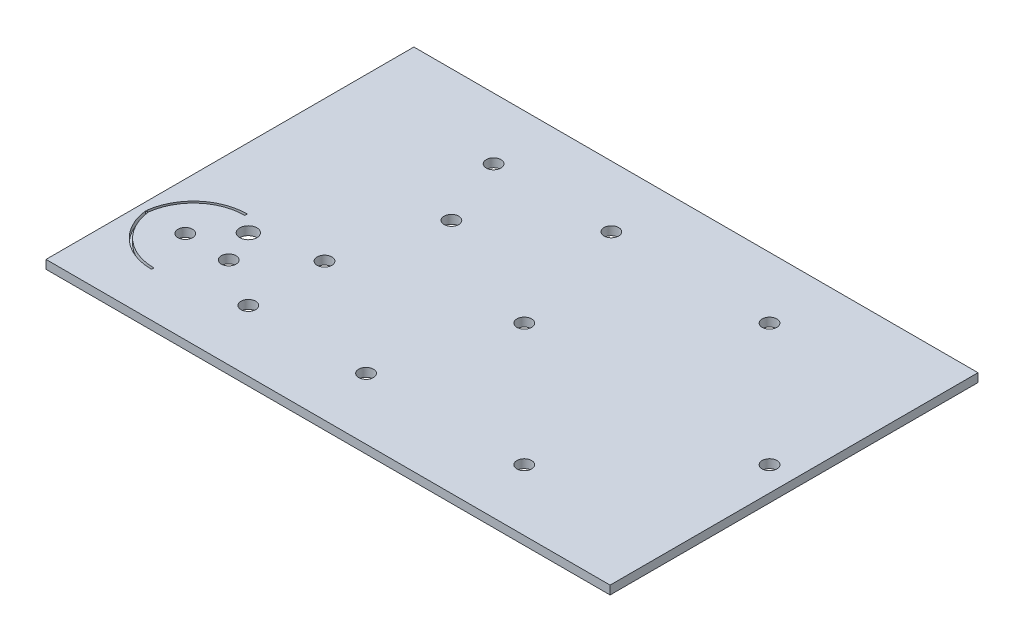
ISO-10303-21;
HEADER;
FILE_DESCRIPTION(('STEP AP214'),'2;1');
FILE_NAME('part.step','',(''),(''),'','','');
FILE_SCHEMA(('AUTOMOTIVE_DESIGN { 1 0 10303 214 1 1 1 1 }'));
ENDSEC;
DATA;
#1=APPLICATION_CONTEXT('core data for automotive mechanical design processes');
#2=APPLICATION_PROTOCOL_DEFINITION('international standard','automotive_design',2000,#1);
#3=PRODUCT_CONTEXT('',#1,'mechanical');
#4=PRODUCT('Part','Part','',(#3));
#5=PRODUCT_RELATED_PRODUCT_CATEGORY('part','',(#4));
#6=PRODUCT_DEFINITION_FORMATION('','',#4);
#7=PRODUCT_DEFINITION_CONTEXT('part definition',#1,'design');
#8=PRODUCT_DEFINITION('design','',#6,#7);
#9=PRODUCT_DEFINITION_SHAPE('','',#8);
#10=(LENGTH_UNIT() NAMED_UNIT(*) SI_UNIT(.MILLI.,.METRE.));
#11=(NAMED_UNIT(*) PLANE_ANGLE_UNIT() SI_UNIT($,.RADIAN.));
#12=(NAMED_UNIT(*) SI_UNIT($,.STERADIAN.) SOLID_ANGLE_UNIT());
#13=UNCERTAINTY_MEASURE_WITH_UNIT(LENGTH_MEASURE(1.E-05),#10,'distance_accuracy_value','');
#14=(GEOMETRIC_REPRESENTATION_CONTEXT(3) GLOBAL_UNCERTAINTY_ASSIGNED_CONTEXT((#13)) GLOBAL_UNIT_ASSIGNED_CONTEXT((#10,
#11,#12)) REPRESENTATION_CONTEXT('',''));
#15=CARTESIAN_POINT('',(0.,0.,0.));
#16=DIRECTION('',(0.,0.,1.));
#17=DIRECTION('',(1.,0.,0.));
#18=AXIS2_PLACEMENT_3D('',#15,#16,#17);
#19=CARTESIAN_POINT('',(0.,-1.5,0.));
#20=DIRECTION('',(0.,1.,0.));
#21=DIRECTION('',(0.,0.,1.));
#22=AXIS2_PLACEMENT_3D('',#19,#20,#21);
#23=PLANE('',#22);
#24=CARTESIAN_POINT('',(-145.,-1.5,35.));
#25=DIRECTION('',(0.,-1.,0.));
#26=DIRECTION('',(0.,0.,1.));
#27=AXIS2_PLACEMENT_3D('',#24,#25,#26);
#28=CIRCLE('',#27,21.);
#29=CARTESIAN_POINT('',(-145.,-1.5,56.));
#30=VERTEX_POINT('',#29);
#31=CARTESIAN_POINT('',(-165.849119966711,-1.5,37.5128065213434));
#32=VERTEX_POINT('',#31);
#33=EDGE_CURVE('E58',#30,#32,#28,.T.);
#34=ORIENTED_EDGE('',*,*,#33,.F.);
#35=DIRECTION('',(0.,0.,-1.));
#36=VECTOR('',#35,1.);
#37=CARTESIAN_POINT('',(-145.,-1.5,56.));
#38=LINE('',#37,#36);
#39=CARTESIAN_POINT('',(-145.,-1.5,57.));
#40=VERTEX_POINT('',#39);
#41=EDGE_CURVE('E165',#40,#30,#38,.T.);
#42=ORIENTED_EDGE('',*,*,#41,.F.);
#43=CARTESIAN_POINT('',(-145.,-1.5,35.));
#44=DIRECTION('',(0.,1.,0.));
#45=DIRECTION('',(0.,0.,1.));
#46=AXIS2_PLACEMENT_3D('',#43,#44,#45);
#47=CIRCLE('',#46,22.);
#48=CARTESIAN_POINT('',(-166.841935203221,-1.5,37.6324639747407));
#49=VERTEX_POINT('',#48);
#50=EDGE_CURVE('E179',#49,#40,#47,.T.);
#51=ORIENTED_EDGE('',*,*,#50,.F.);
#52=DIRECTION('',(-0.992815236510032,0.,0.119657453397307));
#53=VECTOR('',#52,1.);
#54=CARTESIAN_POINT('',(-165.849119966711,-1.5,37.5128065213434));
#55=LINE('',#54,#53);
#56=EDGE_CURVE('E176',#32,#49,#55,.T.);
#57=ORIENTED_EDGE('',*,*,#56,.F.);
#58=EDGE_LOOP('',(#34,#42,#51,#57));
#59=FACE_BOUND('',#58,.T.);
#60=DIRECTION('',(0.,0.,-1.));
#61=VECTOR('',#60,1.);
#62=CARTESIAN_POINT('',(-170.,-1.5,0.));
#63=LINE('',#62,#61);
#64=CARTESIAN_POINT('',(-170.,-1.5,75.));
#65=VERTEX_POINT('',#64);
#66=CARTESIAN_POINT('',(-170.,-1.5,-75.));
#67=VERTEX_POINT('',#66);
#68=EDGE_CURVE('E11',#65,#67,#63,.T.);
#69=ORIENTED_EDGE('',*,*,#68,.F.);
#70=DIRECTION('',(1.,0.,0.));
#71=VECTOR('',#70,1.);
#72=CARTESIAN_POINT('',(-190.,-1.5,75.));
#73=LINE('',#72,#71);
#74=CARTESIAN_POINT('',(60.,-1.5,75.));
#75=VERTEX_POINT('',#74);
#76=EDGE_CURVE('E247',#65,#75,#73,.T.);
#77=ORIENTED_EDGE('',*,*,#76,.T.);
#78=DIRECTION('',(0.,0.,-1.));
#79=VECTOR('',#78,1.);
#80=CARTESIAN_POINT('',(60.,-1.5,75.));
#81=LINE('',#80,#79);
#82=CARTESIAN_POINT('',(60.,-1.5,-75.));
#83=VERTEX_POINT('',#82);
#84=EDGE_CURVE('E249',#75,#83,#81,.T.);
#85=ORIENTED_EDGE('',*,*,#84,.T.);
#86=DIRECTION('',(-1.,0.,0.));
#87=VECTOR('',#86,1.);
#88=CARTESIAN_POINT('',(60.,-1.5,-75.));
#89=LINE('',#88,#87);
#90=EDGE_CURVE('E244',#83,#67,#89,.T.);
#91=ORIENTED_EDGE('',*,*,#90,.T.);
#92=EDGE_LOOP('',(#69,#77,#85,#91));
#93=FACE_BOUND('',#92,.T.);
#94=CARTESIAN_POINT('',(-112.5,-1.5,-50.));
#95=DIRECTION('',(0.,1.,0.));
#96=DIRECTION('',(0.,0.,1.));
#97=AXIS2_PLACEMENT_3D('',#94,#95,#96);
#98=CIRCLE('',#97,3.00000000000001);
#99=CARTESIAN_POINT('',(-112.5,-1.5,-47.));
#100=VERTEX_POINT('',#99);
#101=EDGE_CURVE('E199',#100,#100,#98,.T.);
#102=ORIENTED_EDGE('',*,*,#101,.F.);
#103=EDGE_LOOP('',(#102));
#104=FACE_BOUND('',#103,.T.);
#105=CARTESIAN_POINT('',(-64.5,-1.5,-50.));
#106=DIRECTION('',(0.,1.,0.));
#107=DIRECTION('',(0.,0.,1.));
#108=AXIS2_PLACEMENT_3D('',#105,#106,#107);
#109=CIRCLE('',#108,3.);
#110=CARTESIAN_POINT('',(-64.5,-1.5,-47.));
#111=VERTEX_POINT('',#110);
#112=EDGE_CURVE('E203',#111,#111,#109,.T.);
#113=ORIENTED_EDGE('',*,*,#112,.F.);
#114=EDGE_LOOP('',(#113));
#115=FACE_BOUND('',#114,.T.);
#116=CARTESIAN_POINT('',(50.,-1.5,0.));
#117=DIRECTION('',(0.,1.,0.));
#118=DIRECTION('',(0.,0.,1.));
#119=AXIS2_PLACEMENT_3D('',#116,#117,#118);
#120=CIRCLE('',#119,3.);
#121=CARTESIAN_POINT('',(50.,-1.5,3.));
#122=VERTEX_POINT('',#121);
#123=EDGE_CURVE('E209',#122,#122,#120,.T.);
#124=ORIENTED_EDGE('',*,*,#123,.F.);
#125=EDGE_LOOP('',(#124));
#126=FACE_BOUND('',#125,.T.);
#127=CARTESIAN_POINT('',(0.,-1.5,50.));
#128=DIRECTION('',(0.,1.,0.));
#129=DIRECTION('',(0.,0.,1.));
#130=AXIS2_PLACEMENT_3D('',#127,#128,#129);
#131=CIRCLE('',#130,3.);
#132=CARTESIAN_POINT('',(0.,-1.5,53.));
#133=VERTEX_POINT('',#132);
#134=EDGE_CURVE('E214',#133,#133,#131,.T.);
#135=ORIENTED_EDGE('',*,*,#134,.F.);
#136=EDGE_LOOP('',(#135));
#137=FACE_BOUND('',#136,.T.);
#138=CARTESIAN_POINT('',(0.,-1.5,-50.));
#139=DIRECTION('',(0.,1.,0.));
#140=DIRECTION('',(0.,0.,1.));
#141=AXIS2_PLACEMENT_3D('',#138,#139,#140);
#142=CIRCLE('',#141,3.);
#143=CARTESIAN_POINT('',(0.,-1.5,-47.));
#144=VERTEX_POINT('',#143);
#145=EDGE_CURVE('E217',#144,#144,#142,.T.);
#146=ORIENTED_EDGE('',*,*,#145,.F.);
#147=EDGE_LOOP('',(#146));
#148=FACE_BOUND('',#147,.T.);
#149=CARTESIAN_POINT('',(-64.5,-1.5,50.));
#150=DIRECTION('',(0.,1.,0.));
#151=DIRECTION('',(0.,0.,1.));
#152=AXIS2_PLACEMENT_3D('',#149,#150,#151);
#153=CIRCLE('',#152,3.);
#154=CARTESIAN_POINT('',(-64.5,-1.5,53.));
#155=VERTEX_POINT('',#154);
#156=EDGE_CURVE('E220',#155,#155,#153,.T.);
#157=ORIENTED_EDGE('',*,*,#156,.F.);
#158=EDGE_LOOP('',(#157));
#159=FACE_BOUND('',#158,.T.);
#160=CARTESIAN_POINT('',(-50.,-1.5,0.));
#161=DIRECTION('',(0.,1.,0.));
#162=DIRECTION('',(0.,0.,1.));
#163=AXIS2_PLACEMENT_3D('',#160,#161,#162);
#164=CIRCLE('',#163,3.);
#165=CARTESIAN_POINT('',(-50.,-1.5,3.));
#166=VERTEX_POINT('',#165);
#167=EDGE_CURVE('E223',#166,#166,#164,.T.);
#168=ORIENTED_EDGE('',*,*,#167,.F.);
#169=EDGE_LOOP('',(#168));
#170=FACE_BOUND('',#169,.T.);
#171=CARTESIAN_POINT('',(-101.14,-1.5,-21.42));
#172=DIRECTION('',(0.,1.,0.));
#173=DIRECTION('',(0.,0.,1.));
#174=AXIS2_PLACEMENT_3D('',#171,#172,#173);
#175=CIRCLE('',#174,3.00000000000001);
#176=CARTESIAN_POINT('',(-101.14,-1.5,-18.42));
#177=VERTEX_POINT('',#176);
#178=EDGE_CURVE('E226',#177,#177,#175,.T.);
#179=ORIENTED_EDGE('',*,*,#178,.F.);
#180=EDGE_LOOP('',(#179));
#181=FACE_BOUND('',#180,.T.);
#182=CARTESIAN_POINT('',(-112.5,-1.5,50.));
#183=DIRECTION('',(0.,1.,0.));
#184=DIRECTION('',(0.,0.,1.));
#185=AXIS2_PLACEMENT_3D('',#182,#183,#184);
#186=CIRCLE('',#185,3.00000000000001);
#187=CARTESIAN_POINT('',(-112.5,-1.5,53.));
#188=VERTEX_POINT('',#187);
#189=EDGE_CURVE('E229',#188,#188,#186,.T.);
#190=ORIENTED_EDGE('',*,*,#189,.F.);
#191=EDGE_LOOP('',(#190));
#192=FACE_BOUND('',#191,.T.);
#193=CARTESIAN_POINT('',(-112.61,-1.5,18.84));
#194=DIRECTION('',(0.,1.,0.));
#195=DIRECTION('',(0.,0.,1.));
#196=AXIS2_PLACEMENT_3D('',#193,#194,#195);
#197=CIRCLE('',#196,2.99999999999999);
#198=CARTESIAN_POINT('',(-112.61,-1.5,21.84));
#199=VERTEX_POINT('',#198);
#200=EDGE_CURVE('E232',#199,#199,#197,.T.);
#201=ORIENTED_EDGE('',*,*,#200,.F.);
#202=EDGE_LOOP('',(#201));
#203=FACE_BOUND('',#202,.T.);
#204=CARTESIAN_POINT('',(-132.57,-1.5,37.93));
#205=DIRECTION('',(0.,1.,0.));
#206=DIRECTION('',(0.,0.,1.));
#207=AXIS2_PLACEMENT_3D('',#204,#205,#206);
#208=CIRCLE('',#207,2.99999999999999);
#209=CARTESIAN_POINT('',(-132.57,-1.5,40.93));
#210=VERTEX_POINT('',#209);
#211=EDGE_CURVE('E235',#210,#210,#208,.T.);
#212=ORIENTED_EDGE('',*,*,#211,.F.);
#213=EDGE_LOOP('',(#212));
#214=FACE_BOUND('',#213,.T.);
#215=CARTESIAN_POINT('',(-138.16,-1.5,24.34));
#216=DIRECTION('',(0.,1.,0.));
#217=DIRECTION('',(0.,0.,1.));
#218=AXIS2_PLACEMENT_3D('',#215,#216,#217);
#219=CIRCLE('',#218,3.49999999999999);
#220=CARTESIAN_POINT('',(-138.16,-1.5,27.84));
#221=VERTEX_POINT('',#220);
#222=EDGE_CURVE('E238',#221,#221,#219,.T.);
#223=ORIENTED_EDGE('',*,*,#222,.F.);
#224=EDGE_LOOP('',(#223));
#225=FACE_BOUND('',#224,.T.);
#226=CARTESIAN_POINT('',(-150.76,-1.5,37.46));
#227=DIRECTION('',(0.,1.,0.));
#228=DIRECTION('',(0.,0.,1.));
#229=AXIS2_PLACEMENT_3D('',#226,#227,#228);
#230=CIRCLE('',#229,2.99999999999999);
#231=CARTESIAN_POINT('',(-150.76,-1.5,40.46));
#232=VERTEX_POINT('',#231);
#233=EDGE_CURVE('E241',#232,#232,#230,.T.);
#234=ORIENTED_EDGE('',*,*,#233,.F.);
#235=EDGE_LOOP('',(#234));
#236=FACE_BOUND('',#235,.T.);
#237=DIRECTION('',(0.,0.,1.));
#238=VECTOR('',#237,1.);
#239=CARTESIAN_POINT('',(-145.,-1.5,18.92));
#240=LINE('',#239,#238);
#241=CARTESIAN_POINT('',(-145.,-1.5,17.92));
#242=VERTEX_POINT('',#241);
#243=CARTESIAN_POINT('',(-145.,-1.5,18.92));
#244=VERTEX_POINT('',#243);
#245=EDGE_CURVE('E152',#242,#244,#240,.T.);
#246=ORIENTED_EDGE('',*,*,#245,.T.);
#247=CARTESIAN_POINT('',(-145.,-1.5,39.92));
#248=DIRECTION('',(0.,1.,0.));
#249=DIRECTION('',(0.,0.,-1.));
#250=AXIS2_PLACEMENT_3D('',#247,#248,#249);
#251=CIRCLE('',#250,21.);
#252=CARTESIAN_POINT('',(-165.849119966711,-1.5,37.4071934786566));
#253=VERTEX_POINT('',#252);
#254=EDGE_CURVE('E50',#244,#253,#251,.T.);
#255=ORIENTED_EDGE('',*,*,#254,.T.);
#256=DIRECTION('',(-0.992815236510032,0.,-0.119657453397307));
#257=VECTOR('',#256,1.);
#258=CARTESIAN_POINT('',(-165.849119966711,-1.5,37.4071934786566));
#259=LINE('',#258,#257);
#260=CARTESIAN_POINT('',(-166.841935203221,-1.5,37.2875360252593));
#261=VERTEX_POINT('',#260);
#262=EDGE_CURVE('E143',#253,#261,#259,.T.);
#263=ORIENTED_EDGE('',*,*,#262,.T.);
#264=CARTESIAN_POINT('',(-145.,-1.5,39.92));
#265=DIRECTION('',(0.,-1.,0.));
#266=DIRECTION('',(0.,0.,-1.));
#267=AXIS2_PLACEMENT_3D('',#264,#265,#266);
#268=CIRCLE('',#267,22.);
#269=EDGE_CURVE('E146',#261,#242,#268,.T.);
#270=ORIENTED_EDGE('',*,*,#269,.T.);
#271=EDGE_LOOP('',(#246,#255,#263,#270));
#272=FACE_BOUND('',#271,.T.);
#273=ADVANCED_FACE('F35',(#59,#93,#104,#115,#126,#137,#148,#159,#170,#181,#192,#203,#214,#225,
#236,#272),#23,.T.);
#274=CARTESIAN_POINT('',(-190.,-5.,-75.));
#275=DIRECTION('',(0.,0.,1.));
#276=DIRECTION('',(1.,0.,0.));
#277=AXIS2_PLACEMENT_3D('',#274,#275,#276);
#278=PLANE('',#277);
#279=DIRECTION('',(1.,0.,0.));
#280=VECTOR('',#279,1.);
#281=CARTESIAN_POINT('',(-190.,-5.,-75.));
#282=LINE('',#281,#280);
#283=CARTESIAN_POINT('',(-170.,-5.,-75.));
#284=VERTEX_POINT('',#283);
#285=CARTESIAN_POINT('',(60.,-5.,-75.));
#286=VERTEX_POINT('',#285);
#287=EDGE_CURVE('E289',#284,#286,#282,.T.);
#288=ORIENTED_EDGE('',*,*,#287,.F.);
#289=DIRECTION('',(0.,1.,0.));
#290=VECTOR('',#289,1.);
#291=CARTESIAN_POINT('',(-170.,-5.,-75.));
#292=LINE('',#291,#290);
#293=EDGE_CURVE('E196',#284,#67,#292,.T.);
#294=ORIENTED_EDGE('',*,*,#293,.T.);
#295=ORIENTED_EDGE('',*,*,#90,.F.);
#296=DIRECTION('',(0.,1.,0.));
#297=VECTOR('',#296,1.);
#298=CARTESIAN_POINT('',(60.,-5.,-75.));
#299=LINE('',#298,#297);
#300=EDGE_CURVE('E43',#286,#83,#299,.T.);
#301=ORIENTED_EDGE('',*,*,#300,.F.);
#302=EDGE_LOOP('',(#288,#294,#295,#301));
#303=FACE_BOUND('',#302,.T.);
#304=ADVANCED_FACE('F310',(#303),#278,.F.);
#305=CARTESIAN_POINT('',(60.,-5.,-75.));
#306=DIRECTION('',(-1.,0.,0.));
#307=DIRECTION('',(0.,0.,1.));
#308=AXIS2_PLACEMENT_3D('',#305,#306,#307);
#309=PLANE('',#308);
#310=ORIENTED_EDGE('',*,*,#84,.F.);
#311=DIRECTION('',(0.,1.,0.));
#312=VECTOR('',#311,1.);
#313=CARTESIAN_POINT('',(60.,-5.,75.));
#314=LINE('',#313,#312);
#315=CARTESIAN_POINT('',(60.,-5.,75.));
#316=VERTEX_POINT('',#315);
#317=EDGE_CURVE('E291',#316,#75,#314,.T.);
#318=ORIENTED_EDGE('',*,*,#317,.F.);
#319=DIRECTION('',(0.,0.,1.));
#320=VECTOR('',#319,1.);
#321=CARTESIAN_POINT('',(60.,-5.,-75.));
#322=LINE('',#321,#320);
#323=EDGE_CURVE('E286',#286,#316,#322,.T.);
#324=ORIENTED_EDGE('',*,*,#323,.F.);
#325=ORIENTED_EDGE('',*,*,#300,.T.);
#326=EDGE_LOOP('',(#310,#318,#324,#325));
#327=FACE_BOUND('',#326,.T.);
#328=ADVANCED_FACE('F302',(#327),#309,.F.);
#329=CARTESIAN_POINT('',(-190.,-5.,75.));
#330=DIRECTION('',(0.,0.,1.));
#331=DIRECTION('',(1.,0.,0.));
#332=AXIS2_PLACEMENT_3D('',#329,#330,#331);
#333=PLANE('',#332);
#334=DIRECTION('',(0.,1.,0.));
#335=VECTOR('',#334,1.);
#336=CARTESIAN_POINT('',(-170.,-5.,75.));
#337=LINE('',#336,#335);
#338=CARTESIAN_POINT('',(-170.,-5.,75.));
#339=VERTEX_POINT('',#338);
#340=EDGE_CURVE('E194',#339,#65,#337,.T.);
#341=ORIENTED_EDGE('',*,*,#340,.F.);
#342=DIRECTION('',(1.,0.,0.));
#343=VECTOR('',#342,1.);
#344=CARTESIAN_POINT('',(-190.,-5.,75.));
#345=LINE('',#344,#343);
#346=EDGE_CURVE('E284',#339,#316,#345,.T.);
#347=ORIENTED_EDGE('',*,*,#346,.T.);
#348=ORIENTED_EDGE('',*,*,#317,.T.);
#349=ORIENTED_EDGE('',*,*,#76,.F.);
#350=EDGE_LOOP('',(#341,#347,#348,#349));
#351=FACE_BOUND('',#350,.T.);
#352=ADVANCED_FACE('F37',(#351),#333,.T.);
#353=CARTESIAN_POINT('',(0.,-5.,-50.));
#354=DIRECTION('',(0.,1.,0.));
#355=DIRECTION('',(0.,0.,1.));
#356=AXIS2_PLACEMENT_3D('',#353,#354,#355);
#357=CYLINDRICAL_SURFACE('',#356,3.);
#358=CARTESIAN_POINT('',(0.,-5.,-50.));
#359=DIRECTION('',(0.,1.,0.));
#360=DIRECTION('',(0.,0.,1.));
#361=AXIS2_PLACEMENT_3D('',#358,#359,#360);
#362=CIRCLE('',#361,3.);
#363=CARTESIAN_POINT('',(0.,-5.,-47.));
#364=VERTEX_POINT('',#363);
#365=EDGE_CURVE('E281',#364,#364,#362,.T.);
#366=ORIENTED_EDGE('',*,*,#365,.F.);
#367=EDGE_LOOP('',(#366));
#368=FACE_BOUND('',#367,.T.);
#369=ORIENTED_EDGE('',*,*,#145,.T.);
#370=EDGE_LOOP('',(#369));
#371=FACE_BOUND('',#370,.T.);
#372=ADVANCED_FACE('F376',(#368,#371),#357,.F.);
#373=CARTESIAN_POINT('',(-50.,-5.,0.));
#374=DIRECTION('',(0.,1.,0.));
#375=DIRECTION('',(0.,0.,1.));
#376=AXIS2_PLACEMENT_3D('',#373,#374,#375);
#377=CYLINDRICAL_SURFACE('',#376,3.);
#378=CARTESIAN_POINT('',(-50.,-5.,0.));
#379=DIRECTION('',(0.,1.,0.));
#380=DIRECTION('',(0.,0.,1.));
#381=AXIS2_PLACEMENT_3D('',#378,#379,#380);
#382=CIRCLE('',#381,3.);
#383=CARTESIAN_POINT('',(-50.,-5.,3.));
#384=VERTEX_POINT('',#383);
#385=EDGE_CURVE('E278',#384,#384,#382,.T.);
#386=ORIENTED_EDGE('',*,*,#385,.F.);
#387=EDGE_LOOP('',(#386));
#388=FACE_BOUND('',#387,.T.);
#389=ORIENTED_EDGE('',*,*,#167,.T.);
#390=EDGE_LOOP('',(#389));
#391=FACE_BOUND('',#390,.T.);
#392=ADVANCED_FACE('F373',(#388,#391),#377,.F.);
#393=CARTESIAN_POINT('',(0.,-5.,50.));
#394=DIRECTION('',(0.,1.,0.));
#395=DIRECTION('',(0.,0.,1.));
#396=AXIS2_PLACEMENT_3D('',#393,#394,#395);
#397=CYLINDRICAL_SURFACE('',#396,3.);
#398=CARTESIAN_POINT('',(0.,-5.,50.));
#399=DIRECTION('',(0.,1.,0.));
#400=DIRECTION('',(0.,0.,1.));
#401=AXIS2_PLACEMENT_3D('',#398,#399,#400);
#402=CIRCLE('',#401,3.);
#403=CARTESIAN_POINT('',(0.,-5.,53.));
#404=VERTEX_POINT('',#403);
#405=EDGE_CURVE('E275',#404,#404,#402,.T.);
#406=ORIENTED_EDGE('',*,*,#405,.F.);
#407=EDGE_LOOP('',(#406));
#408=FACE_BOUND('',#407,.T.);
#409=ORIENTED_EDGE('',*,*,#134,.T.);
#410=EDGE_LOOP('',(#409));
#411=FACE_BOUND('',#410,.T.);
#412=ADVANCED_FACE('F369',(#408,#411),#397,.F.);
#413=CARTESIAN_POINT('',(50.,-5.,0.));
#414=DIRECTION('',(0.,1.,0.));
#415=DIRECTION('',(0.,0.,1.));
#416=AXIS2_PLACEMENT_3D('',#413,#414,#415);
#417=CYLINDRICAL_SURFACE('',#416,3.);
#418=CARTESIAN_POINT('',(50.,-5.,0.));
#419=DIRECTION('',(0.,1.,0.));
#420=DIRECTION('',(0.,0.,1.));
#421=AXIS2_PLACEMENT_3D('',#418,#419,#420);
#422=CIRCLE('',#421,3.);
#423=CARTESIAN_POINT('',(50.,-5.,3.));
#424=VERTEX_POINT('',#423);
#425=EDGE_CURVE('E272',#424,#424,#422,.T.);
#426=ORIENTED_EDGE('',*,*,#425,.F.);
#427=EDGE_LOOP('',(#426));
#428=FACE_BOUND('',#427,.T.);
#429=ORIENTED_EDGE('',*,*,#123,.T.);
#430=EDGE_LOOP('',(#429));
#431=FACE_BOUND('',#430,.T.);
#432=ADVANCED_FACE('F365',(#428,#431),#417,.F.);
#433=CARTESIAN_POINT('',(-150.76,-5.,37.46));
#434=DIRECTION('',(0.,1.,0.));
#435=DIRECTION('',(0.,0.,1.));
#436=AXIS2_PLACEMENT_3D('',#433,#434,#435);
#437=CYLINDRICAL_SURFACE('',#436,2.99999999999999);
#438=CARTESIAN_POINT('',(-150.76,-5.,37.46));
#439=DIRECTION('',(0.,1.,0.));
#440=DIRECTION('',(0.,0.,1.));
#441=AXIS2_PLACEMENT_3D('',#438,#439,#440);
#442=CIRCLE('',#441,2.99999999999999);
#443=CARTESIAN_POINT('',(-150.76,-5.,40.46));
#444=VERTEX_POINT('',#443);
#445=EDGE_CURVE('E269',#444,#444,#442,.T.);
#446=ORIENTED_EDGE('',*,*,#445,.F.);
#447=EDGE_LOOP('',(#446));
#448=FACE_BOUND('',#447,.T.);
#449=ORIENTED_EDGE('',*,*,#233,.T.);
#450=EDGE_LOOP('',(#449));
#451=FACE_BOUND('',#450,.T.);
#452=ADVANCED_FACE('F361',(#448,#451),#437,.F.);
#453=CARTESIAN_POINT('',(-132.57,-45.,37.93));
#454=DIRECTION('',(0.,1.,0.));
#455=DIRECTION('',(0.,0.,1.));
#456=AXIS2_PLACEMENT_3D('',#453,#454,#455);
#457=CYLINDRICAL_SURFACE('',#456,2.99999999999999);
#458=CARTESIAN_POINT('',(-132.57,-5.,37.93));
#459=DIRECTION('',(0.,1.,0.));
#460=DIRECTION('',(0.,0.,1.));
#461=AXIS2_PLACEMENT_3D('',#458,#459,#460);
#462=CIRCLE('',#461,2.99999999999999);
#463=CARTESIAN_POINT('',(-132.57,-5.,40.93));
#464=VERTEX_POINT('',#463);
#465=EDGE_CURVE('E266',#464,#464,#462,.T.);
#466=ORIENTED_EDGE('',*,*,#465,.F.);
#467=EDGE_LOOP('',(#466));
#468=FACE_BOUND('',#467,.T.);
#469=ORIENTED_EDGE('',*,*,#211,.T.);
#470=EDGE_LOOP('',(#469));
#471=FACE_BOUND('',#470,.T.);
#472=ADVANCED_FACE('F357',(#468,#471),#457,.F.);
#473=CARTESIAN_POINT('',(-138.16,-45.,24.34));
#474=DIRECTION('',(0.,1.,0.));
#475=DIRECTION('',(0.,0.,1.));
#476=AXIS2_PLACEMENT_3D('',#473,#474,#475);
#477=CYLINDRICAL_SURFACE('',#476,3.49999999999999);
#478=CARTESIAN_POINT('',(-138.16,-5.,24.34));
#479=DIRECTION('',(0.,1.,0.));
#480=DIRECTION('',(0.,0.,1.));
#481=AXIS2_PLACEMENT_3D('',#478,#479,#480);
#482=CIRCLE('',#481,3.49999999999999);
#483=CARTESIAN_POINT('',(-138.16,-5.,27.84));
#484=VERTEX_POINT('',#483);
#485=EDGE_CURVE('E263',#484,#484,#482,.T.);
#486=ORIENTED_EDGE('',*,*,#485,.F.);
#487=EDGE_LOOP('',(#486));
#488=FACE_BOUND('',#487,.T.);
#489=ORIENTED_EDGE('',*,*,#222,.T.);
#490=EDGE_LOOP('',(#489));
#491=FACE_BOUND('',#490,.T.);
#492=ADVANCED_FACE('F353',(#488,#491),#477,.F.);
#493=CARTESIAN_POINT('',(-112.5,-5.,50.));
#494=DIRECTION('',(0.,1.,0.));
#495=DIRECTION('',(0.,0.,1.));
#496=AXIS2_PLACEMENT_3D('',#493,#494,#495);
#497=CYLINDRICAL_SURFACE('',#496,3.00000000000001);
#498=CARTESIAN_POINT('',(-112.5,-5.,50.));
#499=DIRECTION('',(0.,1.,0.));
#500=DIRECTION('',(0.,0.,1.));
#501=AXIS2_PLACEMENT_3D('',#498,#499,#500);
#502=CIRCLE('',#501,3.00000000000001);
#503=CARTESIAN_POINT('',(-112.5,-5.,53.));
#504=VERTEX_POINT('',#503);
#505=EDGE_CURVE('E260',#504,#504,#502,.T.);
#506=ORIENTED_EDGE('',*,*,#505,.F.);
#507=EDGE_LOOP('',(#506));
#508=FACE_BOUND('',#507,.T.);
#509=ORIENTED_EDGE('',*,*,#189,.T.);
#510=EDGE_LOOP('',(#509));
#511=FACE_BOUND('',#510,.T.);
#512=ADVANCED_FACE('F349',(#508,#511),#497,.F.);
#513=CARTESIAN_POINT('',(-64.5,-5.,50.));
#514=DIRECTION('',(0.,1.,0.));
#515=DIRECTION('',(0.,0.,1.));
#516=AXIS2_PLACEMENT_3D('',#513,#514,#515);
#517=CYLINDRICAL_SURFACE('',#516,3.);
#518=CARTESIAN_POINT('',(-64.5,-5.,50.));
#519=DIRECTION('',(0.,1.,0.));
#520=DIRECTION('',(0.,0.,1.));
#521=AXIS2_PLACEMENT_3D('',#518,#519,#520);
#522=CIRCLE('',#521,3.);
#523=CARTESIAN_POINT('',(-64.5,-5.,53.));
#524=VERTEX_POINT('',#523);
#525=EDGE_CURVE('E257',#524,#524,#522,.T.);
#526=ORIENTED_EDGE('',*,*,#525,.F.);
#527=EDGE_LOOP('',(#526));
#528=FACE_BOUND('',#527,.T.);
#529=ORIENTED_EDGE('',*,*,#156,.T.);
#530=EDGE_LOOP('',(#529));
#531=FACE_BOUND('',#530,.T.);
#532=ADVANCED_FACE('F345',(#528,#531),#517,.F.);
#533=CARTESIAN_POINT('',(-112.61,-5.,18.84));
#534=DIRECTION('',(0.,1.,0.));
#535=DIRECTION('',(0.,0.,1.));
#536=AXIS2_PLACEMENT_3D('',#533,#534,#535);
#537=CYLINDRICAL_SURFACE('',#536,2.99999999999999);
#538=CARTESIAN_POINT('',(-112.61,-5.,18.84));
#539=DIRECTION('',(0.,1.,0.));
#540=DIRECTION('',(0.,0.,1.));
#541=AXIS2_PLACEMENT_3D('',#538,#539,#540);
#542=CIRCLE('',#541,2.99999999999999);
#543=CARTESIAN_POINT('',(-112.61,-5.,21.84));
#544=VERTEX_POINT('',#543);
#545=EDGE_CURVE('E254',#544,#544,#542,.T.);
#546=ORIENTED_EDGE('',*,*,#545,.F.);
#547=EDGE_LOOP('',(#546));
#548=FACE_BOUND('',#547,.T.);
#549=ORIENTED_EDGE('',*,*,#200,.T.);
#550=EDGE_LOOP('',(#549));
#551=FACE_BOUND('',#550,.T.);
#552=ADVANCED_FACE('F327',(#548,#551),#537,.F.);
#553=CARTESIAN_POINT('',(-101.14,-5.,-21.42));
#554=DIRECTION('',(0.,1.,0.));
#555=DIRECTION('',(0.,0.,1.));
#556=AXIS2_PLACEMENT_3D('',#553,#554,#555);
#557=CYLINDRICAL_SURFACE('',#556,3.00000000000001);
#558=CARTESIAN_POINT('',(-101.14,-5.,-21.42));
#559=DIRECTION('',(0.,1.,0.));
#560=DIRECTION('',(0.,0.,1.));
#561=AXIS2_PLACEMENT_3D('',#558,#559,#560);
#562=CIRCLE('',#561,3.00000000000001);
#563=CARTESIAN_POINT('',(-101.14,-5.,-18.42));
#564=VERTEX_POINT('',#563);
#565=EDGE_CURVE('E251',#564,#564,#562,.T.);
#566=ORIENTED_EDGE('',*,*,#565,.F.);
#567=EDGE_LOOP('',(#566));
#568=FACE_BOUND('',#567,.T.);
#569=ORIENTED_EDGE('',*,*,#178,.T.);
#570=EDGE_LOOP('',(#569));
#571=FACE_BOUND('',#570,.T.);
#572=ADVANCED_FACE('F317',(#568,#571),#557,.F.);
#573=CARTESIAN_POINT('',(0.,-5.,0.));
#574=DIRECTION('',(0.,1.,0.));
#575=DIRECTION('',(0.,0.,1.));
#576=AXIS2_PLACEMENT_3D('',#573,#574,#575);
#577=PLANE('',#576);
#578=CARTESIAN_POINT('',(-112.5,-5.,-50.));
#579=DIRECTION('',(0.,1.,0.));
#580=DIRECTION('',(0.,0.,1.));
#581=AXIS2_PLACEMENT_3D('',#578,#579,#580);
#582=CIRCLE('',#581,3.00000000000001);
#583=CARTESIAN_POINT('',(-112.5,-5.,-47.));
#584=VERTEX_POINT('',#583);
#585=EDGE_CURVE('E200',#584,#584,#582,.T.);
#586=ORIENTED_EDGE('',*,*,#585,.T.);
#587=EDGE_LOOP('',(#586));
#588=FACE_BOUND('',#587,.T.);
#589=CARTESIAN_POINT('',(-64.5,-5.,-50.));
#590=DIRECTION('',(0.,1.,0.));
#591=DIRECTION('',(0.,0.,1.));
#592=AXIS2_PLACEMENT_3D('',#589,#590,#591);
#593=CIRCLE('',#592,3.);
#594=CARTESIAN_POINT('',(-64.5,-5.,-47.));
#595=VERTEX_POINT('',#594);
#596=EDGE_CURVE('E206',#595,#595,#593,.T.);
#597=ORIENTED_EDGE('',*,*,#596,.T.);
#598=EDGE_LOOP('',(#597));
#599=FACE_BOUND('',#598,.T.);
#600=ORIENTED_EDGE('',*,*,#565,.T.);
#601=EDGE_LOOP('',(#600));
#602=FACE_BOUND('',#601,.T.);
#603=ORIENTED_EDGE('',*,*,#545,.T.);
#604=EDGE_LOOP('',(#603));
#605=FACE_BOUND('',#604,.T.);
#606=ORIENTED_EDGE('',*,*,#525,.T.);
#607=EDGE_LOOP('',(#606));
#608=FACE_BOUND('',#607,.T.);
#609=ORIENTED_EDGE('',*,*,#505,.T.);
#610=EDGE_LOOP('',(#609));
#611=FACE_BOUND('',#610,.T.);
#612=ORIENTED_EDGE('',*,*,#485,.T.);
#613=EDGE_LOOP('',(#612));
#614=FACE_BOUND('',#613,.T.);
#615=ORIENTED_EDGE('',*,*,#465,.T.);
#616=EDGE_LOOP('',(#615));
#617=FACE_BOUND('',#616,.T.);
#618=ORIENTED_EDGE('',*,*,#445,.T.);
#619=EDGE_LOOP('',(#618));
#620=FACE_BOUND('',#619,.T.);
#621=ORIENTED_EDGE('',*,*,#425,.T.);
#622=EDGE_LOOP('',(#621));
#623=FACE_BOUND('',#622,.T.);
#624=ORIENTED_EDGE('',*,*,#405,.T.);
#625=EDGE_LOOP('',(#624));
#626=FACE_BOUND('',#625,.T.);
#627=ORIENTED_EDGE('',*,*,#385,.T.);
#628=EDGE_LOOP('',(#627));
#629=FACE_BOUND('',#628,.T.);
#630=ORIENTED_EDGE('',*,*,#365,.T.);
#631=EDGE_LOOP('',(#630));
#632=FACE_BOUND('',#631,.T.);
#633=ORIENTED_EDGE('',*,*,#346,.F.);
#634=DIRECTION('',(0.,0.,-1.));
#635=VECTOR('',#634,1.);
#636=CARTESIAN_POINT('',(-170.,-5.,0.));
#637=LINE('',#636,#635);
#638=EDGE_CURVE('E186',#339,#284,#637,.T.);
#639=ORIENTED_EDGE('',*,*,#638,.T.);
#640=ORIENTED_EDGE('',*,*,#287,.T.);
#641=ORIENTED_EDGE('',*,*,#323,.T.);
#642=EDGE_LOOP('',(#633,#639,#640,#641));
#643=FACE_BOUND('',#642,.T.);
#644=ADVANCED_FACE('F314',(#588,#599,#602,#605,#608,#611,#614,#617,#620,#623,#626,#629,#632,
#643),#577,.F.);
#645=CARTESIAN_POINT('',(-64.5,-5.,-50.));
#646=DIRECTION('',(0.,1.,0.));
#647=DIRECTION('',(0.,0.,1.));
#648=AXIS2_PLACEMENT_3D('',#645,#646,#647);
#649=CYLINDRICAL_SURFACE('',#648,3.);
#650=ORIENTED_EDGE('',*,*,#596,.F.);
#651=EDGE_LOOP('',(#650));
#652=FACE_BOUND('',#651,.T.);
#653=ORIENTED_EDGE('',*,*,#112,.T.);
#654=EDGE_LOOP('',(#653));
#655=FACE_BOUND('',#654,.T.);
#656=ADVANCED_FACE('F316',(#652,#655),#649,.F.);
#657=CARTESIAN_POINT('',(-112.5,-5.,-50.));
#658=DIRECTION('',(0.,1.,0.));
#659=DIRECTION('',(0.,0.,1.));
#660=AXIS2_PLACEMENT_3D('',#657,#658,#659);
#661=CYLINDRICAL_SURFACE('',#660,3.00000000000001);
#662=ORIENTED_EDGE('',*,*,#585,.F.);
#663=EDGE_LOOP('',(#662));
#664=FACE_BOUND('',#663,.T.);
#665=ORIENTED_EDGE('',*,*,#101,.T.);
#666=EDGE_LOOP('',(#665));
#667=FACE_BOUND('',#666,.T.);
#668=ADVANCED_FACE('F324',(#664,#667),#661,.F.);
#669=CARTESIAN_POINT('',(-170.,-11.5,-90.7473220397426));
#670=DIRECTION('',(1.,0.,0.));
#671=DIRECTION('',(0.,0.,-1.));
#672=AXIS2_PLACEMENT_3D('',#669,#670,#671);
#673=PLANE('',#672);
#674=ORIENTED_EDGE('',*,*,#638,.F.);
#675=ORIENTED_EDGE('',*,*,#340,.T.);
#676=ORIENTED_EDGE('',*,*,#68,.T.);
#677=ORIENTED_EDGE('',*,*,#293,.F.);
#678=EDGE_LOOP('',(#674,#675,#676,#677));
#679=FACE_BOUND('',#678,.T.);
#680=ADVANCED_FACE('F312',(#679),#673,.F.);
#681=CARTESIAN_POINT('',(-145.,-3.5,35.));
#682=DIRECTION('',(0.,1.,0.));
#683=DIRECTION('',(0.,0.,1.));
#684=AXIS2_PLACEMENT_3D('',#681,#682,#683);
#685=CYLINDRICAL_SURFACE('',#684,21.);
#686=ORIENTED_EDGE('',*,*,#33,.T.);
#687=DIRECTION('',(0.,1.,0.));
#688=VECTOR('',#687,1.);
#689=CARTESIAN_POINT('',(-165.849119966711,-3.5,37.5128065213434));
#690=LINE('',#689,#688);
#691=CARTESIAN_POINT('',(-165.849119966711,-3.5,37.5128065213434));
#692=VERTEX_POINT('',#691);
#693=EDGE_CURVE('E174',#692,#32,#690,.T.);
#694=ORIENTED_EDGE('',*,*,#693,.F.);
#695=CARTESIAN_POINT('',(-145.,-3.5,35.));
#696=DIRECTION('',(0.,-1.,0.));
#697=DIRECTION('',(0.,0.,1.));
#698=AXIS2_PLACEMENT_3D('',#695,#696,#697);
#699=CIRCLE('',#698,21.);
#700=CARTESIAN_POINT('',(-145.,-3.5,56.));
#701=VERTEX_POINT('',#700);
#702=EDGE_CURVE('E161',#701,#692,#699,.T.);
#703=ORIENTED_EDGE('',*,*,#702,.F.);
#704=DIRECTION('',(0.,1.,0.));
#705=VECTOR('',#704,1.);
#706=CARTESIAN_POINT('',(-145.,-3.5,56.));
#707=LINE('',#706,#705);
#708=EDGE_CURVE('E184',#701,#30,#707,.T.);
#709=ORIENTED_EDGE('',*,*,#708,.T.);
#710=EDGE_LOOP('',(#686,#694,#703,#709));
#711=FACE_BOUND('',#710,.T.);
#712=ADVANCED_FACE('F431',(#711),#685,.T.);
#713=CARTESIAN_POINT('',(-145.,-3.5,56.));
#714=DIRECTION('',(1.,0.,0.));
#715=DIRECTION('',(0.,0.,-1.));
#716=AXIS2_PLACEMENT_3D('',#713,#714,#715);
#717=PLANE('',#716);
#718=ORIENTED_EDGE('',*,*,#41,.T.);
#719=ORIENTED_EDGE('',*,*,#708,.F.);
#720=DIRECTION('',(0.,0.,-1.));
#721=VECTOR('',#720,1.);
#722=CARTESIAN_POINT('',(-145.,-3.5,56.));
#723=LINE('',#722,#721);
#724=CARTESIAN_POINT('',(-145.,-3.5,57.));
#725=VERTEX_POINT('',#724);
#726=EDGE_CURVE('E171',#725,#701,#723,.T.);
#727=ORIENTED_EDGE('',*,*,#726,.F.);
#728=DIRECTION('',(0.,1.,0.));
#729=VECTOR('',#728,1.);
#730=CARTESIAN_POINT('',(-145.,-3.5,57.));
#731=LINE('',#730,#729);
#732=EDGE_CURVE('E187',#725,#40,#731,.T.);
#733=ORIENTED_EDGE('',*,*,#732,.T.);
#734=EDGE_LOOP('',(#718,#719,#727,#733));
#735=FACE_BOUND('',#734,.T.);
#736=ADVANCED_FACE('F427',(#735),#717,.F.);
#737=CARTESIAN_POINT('',(-145.,-3.5,35.));
#738=DIRECTION('',(0.,1.,0.));
#739=DIRECTION('',(0.,0.,1.));
#740=AXIS2_PLACEMENT_3D('',#737,#738,#739);
#741=CYLINDRICAL_SURFACE('',#740,22.);
#742=ORIENTED_EDGE('',*,*,#50,.T.);
#743=ORIENTED_EDGE('',*,*,#732,.F.);
#744=CARTESIAN_POINT('',(-145.,-3.5,35.));
#745=DIRECTION('',(0.,1.,0.));
#746=DIRECTION('',(0.,0.,1.));
#747=AXIS2_PLACEMENT_3D('',#744,#745,#746);
#748=CIRCLE('',#747,22.);
#749=CARTESIAN_POINT('',(-166.841935203221,-3.5,37.6324639747407));
#750=VERTEX_POINT('',#749);
#751=EDGE_CURVE('E168',#750,#725,#748,.T.);
#752=ORIENTED_EDGE('',*,*,#751,.F.);
#753=DIRECTION('',(0.,1.,0.));
#754=VECTOR('',#753,1.);
#755=CARTESIAN_POINT('',(-166.841935203221,-3.5,37.6324639747407));
#756=LINE('',#755,#754);
#757=EDGE_CURVE('E189',#750,#49,#756,.T.);
#758=ORIENTED_EDGE('',*,*,#757,.T.);
#759=EDGE_LOOP('',(#742,#743,#752,#758));
#760=FACE_BOUND('',#759,.T.);
#761=ADVANCED_FACE('F430',(#760),#741,.F.);
#762=CARTESIAN_POINT('',(-165.849119966711,-3.5,37.5128065213434));
#763=DIRECTION('',(-0.119657453397307,0.,-0.992815236510032));
#764=DIRECTION('',(-0.992815236510032,0.,0.119657453397307));
#765=AXIS2_PLACEMENT_3D('',#762,#763,#764);
#766=PLANE('',#765);
#767=ORIENTED_EDGE('',*,*,#56,.T.);
#768=ORIENTED_EDGE('',*,*,#757,.F.);
#769=DIRECTION('',(-0.992815236510032,0.,0.119657453397307));
#770=VECTOR('',#769,1.);
#771=CARTESIAN_POINT('',(-165.849119966711,-3.5,37.5128065213434));
#772=LINE('',#771,#770);
#773=EDGE_CURVE('E164',#692,#750,#772,.T.);
#774=ORIENTED_EDGE('',*,*,#773,.F.);
#775=ORIENTED_EDGE('',*,*,#693,.T.);
#776=EDGE_LOOP('',(#767,#768,#774,#775));
#777=FACE_BOUND('',#776,.T.);
#778=ADVANCED_FACE('F425',(#777),#766,.F.);
#779=CARTESIAN_POINT('',(-145.,-3.5,35.));
#780=DIRECTION('',(0.,1.,0.));
#781=DIRECTION('',(0.,0.,1.));
#782=AXIS2_PLACEMENT_3D('',#779,#780,#781);
#783=PLANE('',#782);
#784=ORIENTED_EDGE('',*,*,#702,.T.);
#785=ORIENTED_EDGE('',*,*,#773,.T.);
#786=ORIENTED_EDGE('',*,*,#751,.T.);
#787=ORIENTED_EDGE('',*,*,#726,.T.);
#788=EDGE_LOOP('',(#784,#785,#786,#787));
#789=FACE_BOUND('',#788,.T.);
#790=ADVANCED_FACE('F417',(#789),#783,.T.);
#791=CARTESIAN_POINT('',(-145.,-3.5,39.92));
#792=DIRECTION('',(0.,1.,0.));
#793=DIRECTION('',(0.,0.,1.));
#794=AXIS2_PLACEMENT_3D('',#791,#792,#793);
#795=CYLINDRICAL_SURFACE('',#794,21.);
#796=ORIENTED_EDGE('',*,*,#254,.F.);
#797=DIRECTION('',(0.,1.,0.));
#798=VECTOR('',#797,1.);
#799=CARTESIAN_POINT('',(-145.,-3.5,18.92));
#800=LINE('',#799,#798);
#801=CARTESIAN_POINT('',(-145.,-3.5,18.92));
#802=VERTEX_POINT('',#801);
#803=EDGE_CURVE('E128',#802,#244,#800,.T.);
#804=ORIENTED_EDGE('',*,*,#803,.F.);
#805=CARTESIAN_POINT('',(-145.,-3.5,39.92));
#806=DIRECTION('',(0.,1.,0.));
#807=DIRECTION('',(0.,0.,-1.));
#808=AXIS2_PLACEMENT_3D('',#805,#806,#807);
#809=CIRCLE('',#808,21.);
#810=CARTESIAN_POINT('',(-165.849119966711,-3.5,37.4071934786566));
#811=VERTEX_POINT('',#810);
#812=EDGE_CURVE('E135',#802,#811,#809,.T.);
#813=ORIENTED_EDGE('',*,*,#812,.T.);
#814=DIRECTION('',(0.,1.,0.));
#815=VECTOR('',#814,1.);
#816=CARTESIAN_POINT('',(-165.849119966711,-3.5,37.4071934786566));
#817=LINE('',#816,#815);
#818=EDGE_CURVE('E156',#811,#253,#817,.T.);
#819=ORIENTED_EDGE('',*,*,#818,.T.);
#820=EDGE_LOOP('',(#796,#804,#813,#819));
#821=FACE_BOUND('',#820,.T.);
#822=ADVANCED_FACE('F138',(#821),#795,.T.);
#823=CARTESIAN_POINT('',(-165.849119966711,-3.5,37.4071934786566));
#824=DIRECTION('',(0.119657453397307,0.,-0.992815236510032));
#825=DIRECTION('',(-0.992815236510032,0.,-0.119657453397307));
#826=AXIS2_PLACEMENT_3D('',#823,#824,#825);
#827=PLANE('',#826);
#828=ORIENTED_EDGE('',*,*,#262,.F.);
#829=ORIENTED_EDGE('',*,*,#818,.F.);
#830=DIRECTION('',(-0.992815236510032,0.,-0.119657453397307));
#831=VECTOR('',#830,1.);
#832=CARTESIAN_POINT('',(-165.849119966711,-3.5,37.4071934786566));
#833=LINE('',#832,#831);
#834=CARTESIAN_POINT('',(-166.841935203221,-3.5,37.2875360252593));
#835=VERTEX_POINT('',#834);
#836=EDGE_CURVE('E140',#811,#835,#833,.T.);
#837=ORIENTED_EDGE('',*,*,#836,.T.);
#838=DIRECTION('',(0.,1.,0.));
#839=VECTOR('',#838,1.);
#840=CARTESIAN_POINT('',(-166.841935203221,-3.5,37.2875360252593));
#841=LINE('',#840,#839);
#842=EDGE_CURVE('E158',#835,#261,#841,.T.);
#843=ORIENTED_EDGE('',*,*,#842,.T.);
#844=EDGE_LOOP('',(#828,#829,#837,#843));
#845=FACE_BOUND('',#844,.T.);
#846=ADVANCED_FACE('F409',(#845),#827,.T.);
#847=CARTESIAN_POINT('',(-145.,-3.5,39.92));
#848=DIRECTION('',(0.,1.,0.));
#849=DIRECTION('',(0.,0.,1.));
#850=AXIS2_PLACEMENT_3D('',#847,#848,#849);
#851=CYLINDRICAL_SURFACE('',#850,22.);
#852=ORIENTED_EDGE('',*,*,#269,.F.);
#853=ORIENTED_EDGE('',*,*,#842,.F.);
#854=CARTESIAN_POINT('',(-145.,-3.5,39.92));
#855=DIRECTION('',(0.,-1.,0.));
#856=DIRECTION('',(0.,0.,-1.));
#857=AXIS2_PLACEMENT_3D('',#854,#855,#856);
#858=CIRCLE('',#857,22.);
#859=CARTESIAN_POINT('',(-145.,-3.5,17.92));
#860=VERTEX_POINT('',#859);
#861=EDGE_CURVE('E134',#835,#860,#858,.T.);
#862=ORIENTED_EDGE('',*,*,#861,.T.);
#863=DIRECTION('',(0.,1.,0.));
#864=VECTOR('',#863,1.);
#865=CARTESIAN_POINT('',(-145.,-3.5,17.92));
#866=LINE('',#865,#864);
#867=EDGE_CURVE('E130',#860,#242,#866,.T.);
#868=ORIENTED_EDGE('',*,*,#867,.T.);
#869=EDGE_LOOP('',(#852,#853,#862,#868));
#870=FACE_BOUND('',#869,.T.);
#871=ADVANCED_FACE('F407',(#870),#851,.F.);
#872=CARTESIAN_POINT('',(-145.,-3.5,18.92));
#873=DIRECTION('',(-1.,0.,0.));
#874=DIRECTION('',(0.,0.,1.));
#875=AXIS2_PLACEMENT_3D('',#872,#873,#874);
#876=PLANE('',#875);
#877=ORIENTED_EDGE('',*,*,#245,.F.);
#878=ORIENTED_EDGE('',*,*,#867,.F.);
#879=DIRECTION('',(0.,0.,1.));
#880=VECTOR('',#879,1.);
#881=CARTESIAN_POINT('',(-145.,-3.5,18.92));
#882=LINE('',#881,#880);
#883=EDGE_CURVE('E125',#860,#802,#882,.T.);
#884=ORIENTED_EDGE('',*,*,#883,.T.);
#885=ORIENTED_EDGE('',*,*,#803,.T.);
#886=EDGE_LOOP('',(#877,#878,#884,#885));
#887=FACE_BOUND('',#886,.T.);
#888=ADVANCED_FACE('F127',(#887),#876,.T.);
#889=CARTESIAN_POINT('',(-145.,-3.5,39.92));
#890=DIRECTION('',(0.,1.,0.));
#891=DIRECTION('',(0.,0.,-1.));
#892=AXIS2_PLACEMENT_3D('',#889,#890,#891);
#893=PLANE('',#892);
#894=ORIENTED_EDGE('',*,*,#812,.F.);
#895=ORIENTED_EDGE('',*,*,#883,.F.);
#896=ORIENTED_EDGE('',*,*,#861,.F.);
#897=ORIENTED_EDGE('',*,*,#836,.F.);
#898=EDGE_LOOP('',(#894,#895,#896,#897));
#899=FACE_BOUND('',#898,.T.);
#900=ADVANCED_FACE('F142',(#899),#893,.T.);
#901=CLOSED_SHELL('',(#273,#304,#328,#352,#372,#392,#412,#432,#452,#472,#492,#512,#532,#552,
#572,#644,#656,#668,#680,#712,#736,#761,#778,#790,#822,#846,#871,#888,#900));
#902=MANIFOLD_SOLID_BREP('B2',#901);
#903=ADVANCED_BREP_SHAPE_REPRESENTATION('',(#18,#902),#14);
#904=SHAPE_DEFINITION_REPRESENTATION(#9,#903);
ENDSEC;
END-ISO-10303-21;
